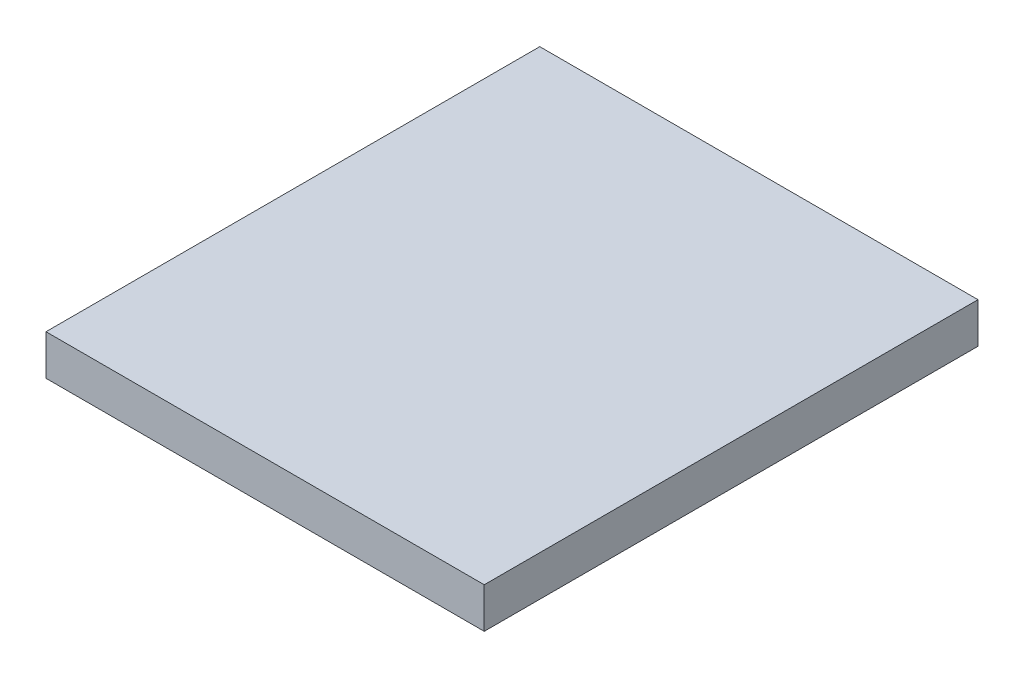
ISO-10303-21;
HEADER;
FILE_DESCRIPTION(('STEP AP214'),'2;1');
FILE_NAME('part.step','',(''),(''),'','','');
FILE_SCHEMA(('AUTOMOTIVE_DESIGN { 1 0 10303 214 1 1 1 1 }'));
ENDSEC;
DATA;
#1=APPLICATION_CONTEXT('core data for automotive mechanical design processes');
#2=APPLICATION_PROTOCOL_DEFINITION('international standard','automotive_design',2000,#1);
#3=PRODUCT_CONTEXT('',#1,'mechanical');
#4=PRODUCT('Part','Part','',(#3));
#5=PRODUCT_RELATED_PRODUCT_CATEGORY('part','',(#4));
#6=PRODUCT_DEFINITION_FORMATION('','',#4);
#7=PRODUCT_DEFINITION_CONTEXT('part definition',#1,'design');
#8=PRODUCT_DEFINITION('design','',#6,#7);
#9=PRODUCT_DEFINITION_SHAPE('','',#8);
#10=(LENGTH_UNIT() NAMED_UNIT(*) SI_UNIT(.MILLI.,.METRE.));
#11=(NAMED_UNIT(*) PLANE_ANGLE_UNIT() SI_UNIT($,.RADIAN.));
#12=(NAMED_UNIT(*) SI_UNIT($,.STERADIAN.) SOLID_ANGLE_UNIT());
#13=UNCERTAINTY_MEASURE_WITH_UNIT(LENGTH_MEASURE(1.E-05),#10,'distance_accuracy_value','');
#14=(GEOMETRIC_REPRESENTATION_CONTEXT(3) GLOBAL_UNCERTAINTY_ASSIGNED_CONTEXT((#13)) GLOBAL_UNIT_ASSIGNED_CONTEXT((#10,
#11,#12)) REPRESENTATION_CONTEXT('',''));
#15=CARTESIAN_POINT('',(0.,0.,0.));
#16=DIRECTION('',(0.,0.,1.));
#17=DIRECTION('',(1.,0.,0.));
#18=AXIS2_PLACEMENT_3D('',#15,#16,#17);
#19=CARTESIAN_POINT('',(0.,0.,25.4));
#20=DIRECTION('',(1.,0.,0.));
#21=DIRECTION('',(0.,0.,-1.));
#22=AXIS2_PLACEMENT_3D('',#19,#20,#21);
#23=PLANE('',#22);
#24=DIRECTION('',(0.,-1.,0.));
#25=VECTOR('',#24,1.);
#26=CARTESIAN_POINT('',(0.,0.,0.));
#27=LINE('',#26,#25);
#28=CARTESIAN_POINT('',(0.,0.,0.));
#29=VERTEX_POINT('',#28);
#30=CARTESIAN_POINT('',(0.,-2.07643333333334,0.));
#31=VERTEX_POINT('',#30);
#32=EDGE_CURVE('E96',#29,#31,#27,.T.);
#33=ORIENTED_EDGE('',*,*,#32,.T.);
#34=DIRECTION('',(0.,0.,-1.));
#35=VECTOR('',#34,1.);
#36=CARTESIAN_POINT('',(0.,-2.07643333333334,25.4));
#37=LINE('',#36,#35);
#38=CARTESIAN_POINT('',(0.,-2.07643333333334,25.4));
#39=VERTEX_POINT('',#38);
#40=EDGE_CURVE('E11',#39,#31,#37,.T.);
#41=ORIENTED_EDGE('',*,*,#40,.F.);
#42=DIRECTION('',(0.,-1.,0.));
#43=VECTOR('',#42,1.);
#44=CARTESIAN_POINT('',(0.,0.,25.4));
#45=LINE('',#44,#43);
#46=CARTESIAN_POINT('',(0.,0.,25.4));
#47=VERTEX_POINT('',#46);
#48=EDGE_CURVE('E84',#47,#39,#45,.T.);
#49=ORIENTED_EDGE('',*,*,#48,.F.);
#50=DIRECTION('',(0.,0.,-1.));
#51=VECTOR('',#50,1.);
#52=CARTESIAN_POINT('',(0.,0.,25.4));
#53=LINE('',#52,#51);
#54=EDGE_CURVE('E92',#47,#29,#53,.T.);
#55=ORIENTED_EDGE('',*,*,#54,.T.);
#56=EDGE_LOOP('',(#33,#41,#49,#55));
#57=FACE_BOUND('',#56,.T.);
#58=ADVANCED_FACE('F33',(#57),#23,.F.);
#59=CARTESIAN_POINT('',(0.,-2.07643333333334,25.4));
#60=DIRECTION('',(0.,1.,0.));
#61=DIRECTION('',(0.,0.,1.));
#62=AXIS2_PLACEMENT_3D('',#59,#60,#61);
#63=PLANE('',#62);
#64=DIRECTION('',(1.,0.,0.));
#65=VECTOR('',#64,1.);
#66=CARTESIAN_POINT('',(0.,-2.07643333333334,0.));
#67=LINE('',#66,#65);
#68=CARTESIAN_POINT('',(22.5441333333333,-2.07643333333334,0.));
#69=VERTEX_POINT('',#68);
#70=EDGE_CURVE('E88',#31,#69,#67,.T.);
#71=ORIENTED_EDGE('',*,*,#70,.T.);
#72=DIRECTION('',(0.,0.,-1.));
#73=VECTOR('',#72,1.);
#74=CARTESIAN_POINT('',(22.5441333333333,-2.07643333333334,25.4));
#75=LINE('',#74,#73);
#76=CARTESIAN_POINT('',(22.5441333333333,-2.07643333333334,25.4));
#77=VERTEX_POINT('',#76);
#78=EDGE_CURVE('E41',#77,#69,#75,.T.);
#79=ORIENTED_EDGE('',*,*,#78,.F.);
#80=DIRECTION('',(1.,0.,0.));
#81=VECTOR('',#80,1.);
#82=CARTESIAN_POINT('',(0.,-2.07643333333334,25.4));
#83=LINE('',#82,#81);
#84=EDGE_CURVE('E79',#39,#77,#83,.T.);
#85=ORIENTED_EDGE('',*,*,#84,.F.);
#86=ORIENTED_EDGE('',*,*,#40,.T.);
#87=EDGE_LOOP('',(#71,#79,#85,#86));
#88=FACE_BOUND('',#87,.T.);
#89=ADVANCED_FACE('F87',(#88),#63,.F.);
#90=CARTESIAN_POINT('',(22.5441333333333,0.,25.4));
#91=DIRECTION('',(-1.,0.,0.));
#92=DIRECTION('',(0.,0.,1.));
#93=AXIS2_PLACEMENT_3D('',#90,#91,#92);
#94=PLANE('',#93);
#95=DIRECTION('',(0.,1.,0.));
#96=VECTOR('',#95,1.);
#97=CARTESIAN_POINT('',(22.5441333333333,0.,0.));
#98=LINE('',#97,#96);
#99=CARTESIAN_POINT('',(22.5441333333333,0.,0.));
#100=VERTEX_POINT('',#99);
#101=EDGE_CURVE('E66',#69,#100,#98,.T.);
#102=ORIENTED_EDGE('',*,*,#101,.T.);
#103=DIRECTION('',(0.,0.,-1.));
#104=VECTOR('',#103,1.);
#105=CARTESIAN_POINT('',(22.5441333333333,0.,25.4));
#106=LINE('',#105,#104);
#107=CARTESIAN_POINT('',(22.5441333333333,0.,25.4));
#108=VERTEX_POINT('',#107);
#109=EDGE_CURVE('E89',#108,#100,#106,.T.);
#110=ORIENTED_EDGE('',*,*,#109,.F.);
#111=DIRECTION('',(0.,1.,0.));
#112=VECTOR('',#111,1.);
#113=CARTESIAN_POINT('',(22.5441333333333,0.,25.4));
#114=LINE('',#113,#112);
#115=EDGE_CURVE('E82',#77,#108,#114,.T.);
#116=ORIENTED_EDGE('',*,*,#115,.F.);
#117=ORIENTED_EDGE('',*,*,#78,.T.);
#118=EDGE_LOOP('',(#102,#110,#116,#117));
#119=FACE_BOUND('',#118,.T.);
#120=ADVANCED_FACE('F90',(#119),#94,.F.);
#121=CARTESIAN_POINT('',(0.,0.,25.4));
#122=DIRECTION('',(0.,-1.,0.));
#123=DIRECTION('',(0.,0.,-1.));
#124=AXIS2_PLACEMENT_3D('',#121,#122,#123);
#125=PLANE('',#124);
#126=DIRECTION('',(-1.,0.,0.));
#127=VECTOR('',#126,1.);
#128=CARTESIAN_POINT('',(0.,0.,0.));
#129=LINE('',#128,#127);
#130=EDGE_CURVE('E72',#100,#29,#129,.T.);
#131=ORIENTED_EDGE('',*,*,#130,.T.);
#132=ORIENTED_EDGE('',*,*,#54,.F.);
#133=DIRECTION('',(-1.,0.,0.));
#134=VECTOR('',#133,1.);
#135=CARTESIAN_POINT('',(0.,0.,25.4));
#136=LINE('',#135,#134);
#137=EDGE_CURVE('E49',#108,#47,#136,.T.);
#138=ORIENTED_EDGE('',*,*,#137,.F.);
#139=ORIENTED_EDGE('',*,*,#109,.T.);
#140=EDGE_LOOP('',(#131,#132,#138,#139));
#141=FACE_BOUND('',#140,.T.);
#142=ADVANCED_FACE('F103',(#141),#125,.F.);
#143=CARTESIAN_POINT('',(0.,-2.07643333333334,25.4));
#144=DIRECTION('',(0.,0.,1.));
#145=DIRECTION('',(1.,0.,0.));
#146=AXIS2_PLACEMENT_3D('',#143,#144,#145);
#147=PLANE('',#146);
#148=ORIENTED_EDGE('',*,*,#48,.T.);
#149=ORIENTED_EDGE('',*,*,#84,.T.);
#150=ORIENTED_EDGE('',*,*,#115,.T.);
#151=ORIENTED_EDGE('',*,*,#137,.T.);
#152=EDGE_LOOP('',(#148,#149,#150,#151));
#153=FACE_BOUND('',#152,.T.);
#154=ADVANCED_FACE('F80',(#153),#147,.T.);
#155=CARTESIAN_POINT('',(0.,-2.07643333333334,0.));
#156=DIRECTION('',(0.,0.,1.));
#157=DIRECTION('',(1.,0.,0.));
#158=AXIS2_PLACEMENT_3D('',#155,#156,#157);
#159=PLANE('',#158);
#160=ORIENTED_EDGE('',*,*,#32,.F.);
#161=ORIENTED_EDGE('',*,*,#130,.F.);
#162=ORIENTED_EDGE('',*,*,#101,.F.);
#163=ORIENTED_EDGE('',*,*,#70,.F.);
#164=EDGE_LOOP('',(#160,#161,#162,#163));
#165=FACE_BOUND('',#164,.T.);
#166=ADVANCED_FACE('F106',(#165),#159,.F.);
#167=CLOSED_SHELL('',(#58,#89,#120,#142,#154,#166));
#168=MANIFOLD_SOLID_BREP('B2',#167);
#169=ADVANCED_BREP_SHAPE_REPRESENTATION('',(#18,#168),#14);
#170=SHAPE_DEFINITION_REPRESENTATION(#9,#169);
ENDSEC;
END-ISO-10303-21;
